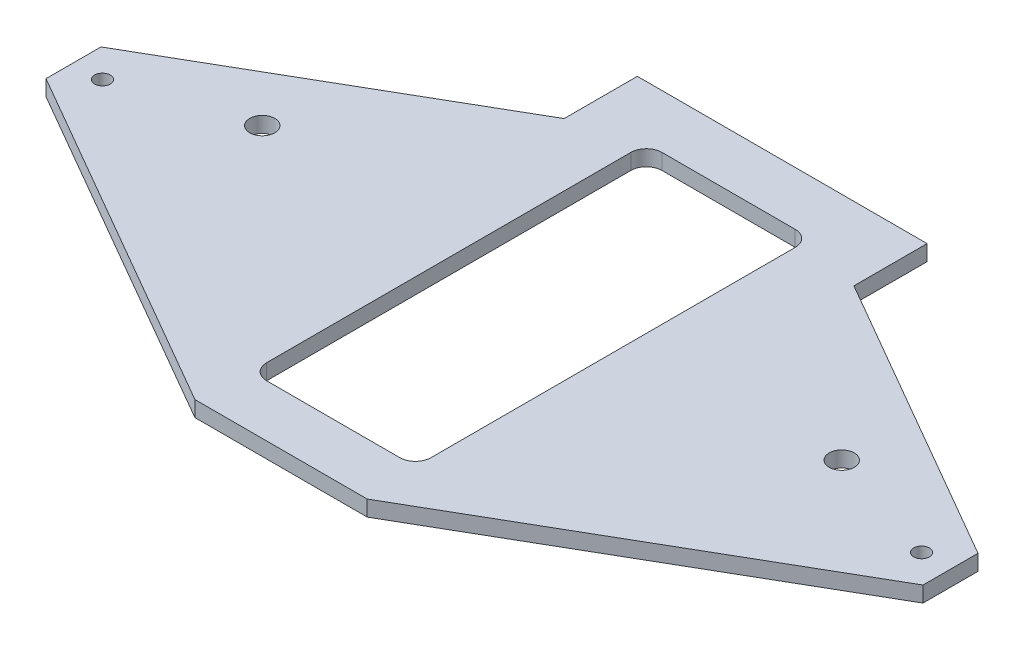
ISO-10303-21;
HEADER;
FILE_DESCRIPTION(('STEP AP214'),'2;1');
FILE_NAME('part.step','',(''),(''),'','','');
FILE_SCHEMA(('AUTOMOTIVE_DESIGN { 1 0 10303 214 1 1 1 1 }'));
ENDSEC;
DATA;
#1=APPLICATION_CONTEXT('core data for automotive mechanical design processes');
#2=APPLICATION_PROTOCOL_DEFINITION('international standard','automotive_design',2000,#1);
#3=PRODUCT_CONTEXT('',#1,'mechanical');
#4=PRODUCT('Part','Part','',(#3));
#5=PRODUCT_RELATED_PRODUCT_CATEGORY('part','',(#4));
#6=PRODUCT_DEFINITION_FORMATION('','',#4);
#7=PRODUCT_DEFINITION_CONTEXT('part definition',#1,'design');
#8=PRODUCT_DEFINITION('design','',#6,#7);
#9=PRODUCT_DEFINITION_SHAPE('','',#8);
#10=(LENGTH_UNIT() NAMED_UNIT(*) SI_UNIT(.MILLI.,.METRE.));
#11=(NAMED_UNIT(*) PLANE_ANGLE_UNIT() SI_UNIT($,.RADIAN.));
#12=(NAMED_UNIT(*) SI_UNIT($,.STERADIAN.) SOLID_ANGLE_UNIT());
#13=UNCERTAINTY_MEASURE_WITH_UNIT(LENGTH_MEASURE(1.E-05),#10,'distance_accuracy_value','');
#14=(GEOMETRIC_REPRESENTATION_CONTEXT(3) GLOBAL_UNCERTAINTY_ASSIGNED_CONTEXT((#13)) GLOBAL_UNIT_ASSIGNED_CONTEXT((#10,
#11,#12)) REPRESENTATION_CONTEXT('',''));
#15=CARTESIAN_POINT('',(0.,0.,0.));
#16=DIRECTION('',(0.,0.,1.));
#17=DIRECTION('',(1.,0.,0.));
#18=AXIS2_PLACEMENT_3D('',#15,#16,#17);
#19=CARTESIAN_POINT('',(-56.,-2.,8.61923788646676));
#20=DIRECTION('',(-0.500000000000001,0.,0.866025403784438));
#21=DIRECTION('',(0.866025403784438,0.,0.500000000000001));
#22=AXIS2_PLACEMENT_3D('',#19,#20,#21);
#23=PLANE('',#22);
#24=DIRECTION('',(0.866025403784438,0.,0.500000000000001));
#25=VECTOR('',#24,1.);
#26=CARTESIAN_POINT('',(-56.,0.,8.61923788646676));
#27=LINE('',#26,#25);
#28=CARTESIAN_POINT('',(-56.,0.,8.61923788646676));
#29=VERTEX_POINT('',#28);
#30=CARTESIAN_POINT('',(-11.,0.,34.6));
#31=VERTEX_POINT('',#30);
#32=EDGE_CURVE('E248',#29,#31,#27,.T.);
#33=ORIENTED_EDGE('',*,*,#32,.F.);
#34=DIRECTION('',(0.,1.,0.));
#35=VECTOR('',#34,1.);
#36=CARTESIAN_POINT('',(-56.,-2.,8.61923788646676));
#37=LINE('',#36,#35);
#38=CARTESIAN_POINT('',(-56.,-2.,8.61923788646676));
#39=VERTEX_POINT('',#38);
#40=EDGE_CURVE('E11',#39,#29,#37,.T.);
#41=ORIENTED_EDGE('',*,*,#40,.F.);
#42=DIRECTION('',(0.866025403784438,0.,0.500000000000001));
#43=VECTOR('',#42,1.);
#44=CARTESIAN_POINT('',(-56.,-2.,8.61923788646676));
#45=LINE('',#44,#43);
#46=CARTESIAN_POINT('',(-11.,-2.,34.6));
#47=VERTEX_POINT('',#46);
#48=EDGE_CURVE('E251',#39,#47,#45,.T.);
#49=ORIENTED_EDGE('',*,*,#48,.T.);
#50=DIRECTION('',(0.,1.,0.));
#51=VECTOR('',#50,1.);
#52=CARTESIAN_POINT('',(-11.,-2.,34.6));
#53=LINE('',#52,#51);
#54=EDGE_CURVE('E36',#47,#31,#53,.T.);
#55=ORIENTED_EDGE('',*,*,#54,.T.);
#56=EDGE_LOOP('',(#33,#41,#49,#55));
#57=FACE_BOUND('',#56,.T.);
#58=ADVANCED_FACE('F33',(#57),#23,.T.);
#59=CARTESIAN_POINT('',(-56.,-2.,1.6));
#60=DIRECTION('',(-1.,0.,0.));
#61=DIRECTION('',(0.,0.,1.));
#62=AXIS2_PLACEMENT_3D('',#59,#60,#61);
#63=PLANE('',#62);
#64=DIRECTION('',(0.,0.,1.));
#65=VECTOR('',#64,1.);
#66=CARTESIAN_POINT('',(-56.,0.,1.6));
#67=LINE('',#66,#65);
#68=CARTESIAN_POINT('',(-56.,0.,1.6));
#69=VERTEX_POINT('',#68);
#70=EDGE_CURVE('E255',#69,#29,#67,.T.);
#71=ORIENTED_EDGE('',*,*,#70,.F.);
#72=DIRECTION('',(0.,1.,0.));
#73=VECTOR('',#72,1.);
#74=CARTESIAN_POINT('',(-56.,-2.,1.6));
#75=LINE('',#74,#73);
#76=CARTESIAN_POINT('',(-56.,-2.,1.6));
#77=VERTEX_POINT('',#76);
#78=EDGE_CURVE('E41',#77,#69,#75,.T.);
#79=ORIENTED_EDGE('',*,*,#78,.F.);
#80=DIRECTION('',(0.,0.,1.));
#81=VECTOR('',#80,1.);
#82=CARTESIAN_POINT('',(-56.,-2.,1.6));
#83=LINE('',#82,#81);
#84=EDGE_CURVE('E279',#77,#39,#83,.T.);
#85=ORIENTED_EDGE('',*,*,#84,.T.);
#86=ORIENTED_EDGE('',*,*,#40,.T.);
#87=EDGE_LOOP('',(#71,#79,#85,#86));
#88=FACE_BOUND('',#87,.T.);
#89=ADVANCED_FACE('F336',(#88),#63,.T.);
#90=CARTESIAN_POINT('',(-18.5,-2.,-20.050635094611));
#91=DIRECTION('',(-0.500000000000001,0.,-0.866025403784438));
#92=DIRECTION('',(-0.866025403784438,0.,0.500000000000001));
#93=AXIS2_PLACEMENT_3D('',#90,#91,#92);
#94=PLANE('',#93);
#95=DIRECTION('',(-0.866025403784438,0.,0.500000000000001));
#96=VECTOR('',#95,1.);
#97=CARTESIAN_POINT('',(-18.5,0.,-20.050635094611));
#98=LINE('',#97,#96);
#99=CARTESIAN_POINT('',(-18.5,0.,-20.050635094611));
#100=VERTEX_POINT('',#99);
#101=EDGE_CURVE('E305',#100,#69,#98,.T.);
#102=ORIENTED_EDGE('',*,*,#101,.F.);
#103=DIRECTION('',(0.,1.,0.));
#104=VECTOR('',#103,1.);
#105=CARTESIAN_POINT('',(-18.5,-2.,-20.050635094611));
#106=LINE('',#105,#104);
#107=CARTESIAN_POINT('',(-18.5,-2.,-20.050635094611));
#108=VERTEX_POINT('',#107);
#109=EDGE_CURVE('E311',#108,#100,#106,.T.);
#110=ORIENTED_EDGE('',*,*,#109,.F.);
#111=DIRECTION('',(-0.866025403784438,0.,0.500000000000001));
#112=VECTOR('',#111,1.);
#113=CARTESIAN_POINT('',(-18.5,-2.,-20.050635094611));
#114=LINE('',#113,#112);
#115=EDGE_CURVE('E276',#108,#77,#114,.T.);
#116=ORIENTED_EDGE('',*,*,#115,.T.);
#117=ORIENTED_EDGE('',*,*,#78,.T.);
#118=EDGE_LOOP('',(#102,#110,#116,#117));
#119=FACE_BOUND('',#118,.T.);
#120=ADVANCED_FACE('F364',(#119),#94,.T.);
#121=CARTESIAN_POINT('',(-18.5,-2.,-29.4));
#122=DIRECTION('',(-1.,0.,0.));
#123=DIRECTION('',(0.,0.,1.));
#124=AXIS2_PLACEMENT_3D('',#121,#122,#123);
#125=PLANE('',#124);
#126=DIRECTION('',(0.,0.,1.));
#127=VECTOR('',#126,1.);
#128=CARTESIAN_POINT('',(-18.5,0.,-29.4));
#129=LINE('',#128,#127);
#130=CARTESIAN_POINT('',(-18.5,0.,-29.4));
#131=VERTEX_POINT('',#130);
#132=EDGE_CURVE('E302',#131,#100,#129,.T.);
#133=ORIENTED_EDGE('',*,*,#132,.F.);
#134=DIRECTION('',(0.,1.,0.));
#135=VECTOR('',#134,1.);
#136=CARTESIAN_POINT('',(-18.5,-2.,-29.4));
#137=LINE('',#136,#135);
#138=CARTESIAN_POINT('',(-18.5,-2.,-29.4));
#139=VERTEX_POINT('',#138);
#140=EDGE_CURVE('E313',#139,#131,#137,.T.);
#141=ORIENTED_EDGE('',*,*,#140,.F.);
#142=DIRECTION('',(0.,0.,1.));
#143=VECTOR('',#142,1.);
#144=CARTESIAN_POINT('',(-18.5,-2.,-29.4));
#145=LINE('',#144,#143);
#146=EDGE_CURVE('E273',#139,#108,#145,.T.);
#147=ORIENTED_EDGE('',*,*,#146,.T.);
#148=ORIENTED_EDGE('',*,*,#109,.T.);
#149=EDGE_LOOP('',(#133,#141,#147,#148));
#150=FACE_BOUND('',#149,.T.);
#151=ADVANCED_FACE('F362',(#150),#125,.T.);
#152=CARTESIAN_POINT('',(18.5,-2.,-29.4));
#153=DIRECTION('',(0.,0.,-1.));
#154=DIRECTION('',(-1.,0.,0.));
#155=AXIS2_PLACEMENT_3D('',#152,#153,#154);
#156=PLANE('',#155);
#157=DIRECTION('',(-1.,0.,0.));
#158=VECTOR('',#157,1.);
#159=CARTESIAN_POINT('',(18.5,0.,-29.4));
#160=LINE('',#159,#158);
#161=CARTESIAN_POINT('',(18.5,0.,-29.4));
#162=VERTEX_POINT('',#161);
#163=EDGE_CURVE('E299',#162,#131,#160,.T.);
#164=ORIENTED_EDGE('',*,*,#163,.F.);
#165=DIRECTION('',(0.,1.,0.));
#166=VECTOR('',#165,1.);
#167=CARTESIAN_POINT('',(18.5,-2.,-29.4));
#168=LINE('',#167,#166);
#169=CARTESIAN_POINT('',(18.5,-2.,-29.4));
#170=VERTEX_POINT('',#169);
#171=EDGE_CURVE('E315',#170,#162,#168,.T.);
#172=ORIENTED_EDGE('',*,*,#171,.F.);
#173=DIRECTION('',(-1.,0.,0.));
#174=VECTOR('',#173,1.);
#175=CARTESIAN_POINT('',(18.5,-2.,-29.4));
#176=LINE('',#175,#174);
#177=EDGE_CURVE('E270',#170,#139,#176,.T.);
#178=ORIENTED_EDGE('',*,*,#177,.T.);
#179=ORIENTED_EDGE('',*,*,#140,.T.);
#180=EDGE_LOOP('',(#164,#172,#178,#179));
#181=FACE_BOUND('',#180,.T.);
#182=ADVANCED_FACE('F358',(#181),#156,.T.);
#183=CARTESIAN_POINT('',(18.5,-2.,-20.050635094611));
#184=DIRECTION('',(1.,0.,0.));
#185=DIRECTION('',(0.,0.,-1.));
#186=AXIS2_PLACEMENT_3D('',#183,#184,#185);
#187=PLANE('',#186);
#188=DIRECTION('',(0.,0.,-1.));
#189=VECTOR('',#188,1.);
#190=CARTESIAN_POINT('',(18.5,0.,-20.050635094611));
#191=LINE('',#190,#189);
#192=CARTESIAN_POINT('',(18.5,0.,-20.050635094611));
#193=VERTEX_POINT('',#192);
#194=EDGE_CURVE('E296',#193,#162,#191,.T.);
#195=ORIENTED_EDGE('',*,*,#194,.F.);
#196=DIRECTION('',(0.,1.,0.));
#197=VECTOR('',#196,1.);
#198=CARTESIAN_POINT('',(18.5,-2.,-20.050635094611));
#199=LINE('',#198,#197);
#200=CARTESIAN_POINT('',(18.5,-2.,-20.050635094611));
#201=VERTEX_POINT('',#200);
#202=EDGE_CURVE('E317',#201,#193,#199,.T.);
#203=ORIENTED_EDGE('',*,*,#202,.F.);
#204=DIRECTION('',(0.,0.,-1.));
#205=VECTOR('',#204,1.);
#206=CARTESIAN_POINT('',(18.5,-2.,-20.050635094611));
#207=LINE('',#206,#205);
#208=EDGE_CURVE('E267',#201,#170,#207,.T.);
#209=ORIENTED_EDGE('',*,*,#208,.T.);
#210=ORIENTED_EDGE('',*,*,#171,.T.);
#211=EDGE_LOOP('',(#195,#203,#209,#210));
#212=FACE_BOUND('',#211,.T.);
#213=ADVANCED_FACE('F354',(#212),#187,.T.);
#214=CARTESIAN_POINT('',(56.,-2.,1.6));
#215=DIRECTION('',(0.500000000000001,0.,-0.866025403784438));
#216=DIRECTION('',(-0.866025403784438,0.,-0.500000000000001));
#217=AXIS2_PLACEMENT_3D('',#214,#215,#216);
#218=PLANE('',#217);
#219=DIRECTION('',(-0.866025403784438,0.,-0.500000000000001));
#220=VECTOR('',#219,1.);
#221=CARTESIAN_POINT('',(56.,0.,1.6));
#222=LINE('',#221,#220);
#223=CARTESIAN_POINT('',(56.,0.,1.6));
#224=VERTEX_POINT('',#223);
#225=EDGE_CURVE('E293',#224,#193,#222,.T.);
#226=ORIENTED_EDGE('',*,*,#225,.F.);
#227=DIRECTION('',(0.,1.,0.));
#228=VECTOR('',#227,1.);
#229=CARTESIAN_POINT('',(56.,-2.,1.6));
#230=LINE('',#229,#228);
#231=CARTESIAN_POINT('',(56.,-2.,1.6));
#232=VERTEX_POINT('',#231);
#233=EDGE_CURVE('E319',#232,#224,#230,.T.);
#234=ORIENTED_EDGE('',*,*,#233,.F.);
#235=DIRECTION('',(-0.866025403784438,0.,-0.500000000000001));
#236=VECTOR('',#235,1.);
#237=CARTESIAN_POINT('',(56.,-2.,1.6));
#238=LINE('',#237,#236);
#239=EDGE_CURVE('E264',#232,#201,#238,.T.);
#240=ORIENTED_EDGE('',*,*,#239,.T.);
#241=ORIENTED_EDGE('',*,*,#202,.T.);
#242=EDGE_LOOP('',(#226,#234,#240,#241));
#243=FACE_BOUND('',#242,.T.);
#244=ADVANCED_FACE('F350',(#243),#218,.T.);
#245=CARTESIAN_POINT('',(56.,-2.,8.61923788646676));
#246=DIRECTION('',(1.,0.,0.));
#247=DIRECTION('',(0.,0.,-1.));
#248=AXIS2_PLACEMENT_3D('',#245,#246,#247);
#249=PLANE('',#248);
#250=DIRECTION('',(0.,0.,-1.));
#251=VECTOR('',#250,1.);
#252=CARTESIAN_POINT('',(56.,0.,8.61923788646676));
#253=LINE('',#252,#251);
#254=CARTESIAN_POINT('',(56.,0.,8.61923788646676));
#255=VERTEX_POINT('',#254);
#256=EDGE_CURVE('E290',#255,#224,#253,.T.);
#257=ORIENTED_EDGE('',*,*,#256,.F.);
#258=DIRECTION('',(0.,1.,0.));
#259=VECTOR('',#258,1.);
#260=CARTESIAN_POINT('',(56.,-2.,8.61923788646676));
#261=LINE('',#260,#259);
#262=CARTESIAN_POINT('',(56.,-2.,8.61923788646676));
#263=VERTEX_POINT('',#262);
#264=EDGE_CURVE('E321',#263,#255,#261,.T.);
#265=ORIENTED_EDGE('',*,*,#264,.F.);
#266=DIRECTION('',(0.,0.,-1.));
#267=VECTOR('',#266,1.);
#268=CARTESIAN_POINT('',(56.,-2.,8.61923788646676));
#269=LINE('',#268,#267);
#270=EDGE_CURVE('E261',#263,#232,#269,.T.);
#271=ORIENTED_EDGE('',*,*,#270,.T.);
#272=ORIENTED_EDGE('',*,*,#233,.T.);
#273=EDGE_LOOP('',(#257,#265,#271,#272));
#274=FACE_BOUND('',#273,.T.);
#275=ADVANCED_FACE('F348',(#274),#249,.T.);
#276=CARTESIAN_POINT('',(11.,-2.,34.6));
#277=DIRECTION('',(0.500000000000001,0.,0.866025403784438));
#278=DIRECTION('',(0.866025403784438,0.,-0.500000000000001));
#279=AXIS2_PLACEMENT_3D('',#276,#277,#278);
#280=PLANE('',#279);
#281=DIRECTION('',(0.866025403784438,0.,-0.500000000000001));
#282=VECTOR('',#281,1.);
#283=CARTESIAN_POINT('',(11.,0.,34.6));
#284=LINE('',#283,#282);
#285=CARTESIAN_POINT('',(11.,0.,34.6));
#286=VERTEX_POINT('',#285);
#287=EDGE_CURVE('E287',#286,#255,#284,.T.);
#288=ORIENTED_EDGE('',*,*,#287,.F.);
#289=DIRECTION('',(0.,1.,0.));
#290=VECTOR('',#289,1.);
#291=CARTESIAN_POINT('',(11.,-2.,34.6));
#292=LINE('',#291,#290);
#293=CARTESIAN_POINT('',(11.,-2.,34.6));
#294=VERTEX_POINT('',#293);
#295=EDGE_CURVE('E322',#294,#286,#292,.T.);
#296=ORIENTED_EDGE('',*,*,#295,.F.);
#297=DIRECTION('',(0.866025403784438,0.,-0.500000000000001));
#298=VECTOR('',#297,1.);
#299=CARTESIAN_POINT('',(11.,-2.,34.6));
#300=LINE('',#299,#298);
#301=EDGE_CURVE('E258',#294,#263,#300,.T.);
#302=ORIENTED_EDGE('',*,*,#301,.T.);
#303=ORIENTED_EDGE('',*,*,#264,.T.);
#304=EDGE_LOOP('',(#288,#296,#302,#303));
#305=FACE_BOUND('',#304,.T.);
#306=ADVANCED_FACE('F344',(#305),#280,.T.);
#307=CARTESIAN_POINT('',(-11.,-2.,34.6));
#308=DIRECTION('',(0.,0.,1.));
#309=DIRECTION('',(1.,0.,0.));
#310=AXIS2_PLACEMENT_3D('',#307,#308,#309);
#311=PLANE('',#310);
#312=DIRECTION('',(1.,0.,0.));
#313=VECTOR('',#312,1.);
#314=CARTESIAN_POINT('',(-11.,0.,34.6));
#315=LINE('',#314,#313);
#316=EDGE_CURVE('E284',#31,#286,#315,.T.);
#317=ORIENTED_EDGE('',*,*,#316,.F.);
#318=ORIENTED_EDGE('',*,*,#54,.F.);
#319=DIRECTION('',(1.,0.,0.));
#320=VECTOR('',#319,1.);
#321=CARTESIAN_POINT('',(-11.,-2.,34.6));
#322=LINE('',#321,#320);
#323=EDGE_CURVE('E254',#47,#294,#322,.T.);
#324=ORIENTED_EDGE('',*,*,#323,.T.);
#325=ORIENTED_EDGE('',*,*,#295,.T.);
#326=EDGE_LOOP('',(#317,#318,#324,#325));
#327=FACE_BOUND('',#326,.T.);
#328=ADVANCED_FACE('F330',(#327),#311,.T.);
#329=CARTESIAN_POINT('',(0.,-2.,0.));
#330=DIRECTION('',(0.,1.,0.));
#331=DIRECTION('',(0.,0.,1.));
#332=AXIS2_PLACEMENT_3D('',#329,#330,#331);
#333=PLANE('',#332);
#334=DIRECTION('',(-1.,0.,0.));
#335=VECTOR('',#334,1.);
#336=CARTESIAN_POINT('',(-8.50000000000006,-2.,-22.556));
#337=LINE('',#336,#335);
#338=CARTESIAN_POINT('',(8.49999999999994,-2.,-22.556));
#339=VERTEX_POINT('',#338);
#340=CARTESIAN_POINT('',(-8.50000000000006,-2.,-22.556));
#341=VERTEX_POINT('',#340);
#342=EDGE_CURVE('E166',#339,#341,#337,.T.);
#343=ORIENTED_EDGE('',*,*,#342,.T.);
#344=CARTESIAN_POINT('',(-8.50000000000006,-2.,-20.556));
#345=DIRECTION('',(0.,1.,0.));
#346=DIRECTION('',(0.,0.,1.));
#347=AXIS2_PLACEMENT_3D('',#344,#345,#346);
#348=CIRCLE('',#347,2.);
#349=CARTESIAN_POINT('',(-10.5000000000001,-2.,-20.556));
#350=VERTEX_POINT('',#349);
#351=EDGE_CURVE('E160',#341,#350,#348,.T.);
#352=ORIENTED_EDGE('',*,*,#351,.T.);
#353=DIRECTION('',(0.,0.,1.));
#354=VECTOR('',#353,1.);
#355=CARTESIAN_POINT('',(-10.5000000000001,-2.,25.944));
#356=LINE('',#355,#354);
#357=CARTESIAN_POINT('',(-10.5000000000001,-2.,25.944));
#358=VERTEX_POINT('',#357);
#359=EDGE_CURVE('E169',#350,#358,#356,.T.);
#360=ORIENTED_EDGE('',*,*,#359,.T.);
#361=CARTESIAN_POINT('',(-8.50000000000006,-2.,25.944));
#362=DIRECTION('',(0.,1.,0.));
#363=DIRECTION('',(0.,0.,1.));
#364=AXIS2_PLACEMENT_3D('',#361,#362,#363);
#365=CIRCLE('',#364,2.);
#366=CARTESIAN_POINT('',(-8.50000000000006,-2.,27.944));
#367=VERTEX_POINT('',#366);
#368=EDGE_CURVE('E49',#358,#367,#365,.T.);
#369=ORIENTED_EDGE('',*,*,#368,.T.);
#370=DIRECTION('',(1.,0.,0.));
#371=VECTOR('',#370,1.);
#372=CARTESIAN_POINT('',(8.49999999999994,-2.,27.944));
#373=LINE('',#372,#371);
#374=CARTESIAN_POINT('',(8.49999999999994,-2.,27.944));
#375=VERTEX_POINT('',#374);
#376=EDGE_CURVE('E184',#367,#375,#373,.T.);
#377=ORIENTED_EDGE('',*,*,#376,.T.);
#378=CARTESIAN_POINT('',(8.49999999999994,-2.,25.944));
#379=DIRECTION('',(0.,1.,0.));
#380=DIRECTION('',(0.,0.,1.));
#381=AXIS2_PLACEMENT_3D('',#378,#379,#380);
#382=CIRCLE('',#381,2.);
#383=CARTESIAN_POINT('',(10.4999999999999,-2.,25.944));
#384=VERTEX_POINT('',#383);
#385=EDGE_CURVE('E187',#375,#384,#382,.T.);
#386=ORIENTED_EDGE('',*,*,#385,.T.);
#387=DIRECTION('',(0.,0.,-1.));
#388=VECTOR('',#387,1.);
#389=CARTESIAN_POINT('',(10.4999999999999,-2.,-20.556));
#390=LINE('',#389,#388);
#391=CARTESIAN_POINT('',(10.4999999999999,-2.,-20.556));
#392=VERTEX_POINT('',#391);
#393=EDGE_CURVE('E190',#384,#392,#390,.T.);
#394=ORIENTED_EDGE('',*,*,#393,.T.);
#395=CARTESIAN_POINT('',(8.49999999999994,-2.,-20.556));
#396=DIRECTION('',(0.,1.,0.));
#397=DIRECTION('',(0.,0.,1.));
#398=AXIS2_PLACEMENT_3D('',#395,#396,#397);
#399=CIRCLE('',#398,2.);
#400=EDGE_CURVE('E193',#392,#339,#399,.T.);
#401=ORIENTED_EDGE('',*,*,#400,.T.);
#402=EDGE_LOOP('',(#343,#352,#360,#369,#377,#386,#394,#401));
#403=FACE_BOUND('',#402,.T.);
#404=CARTESIAN_POINT('',(-37.0000000000001,-2.,0.));
#405=DIRECTION('',(0.,1.,0.));
#406=DIRECTION('',(0.,0.,1.));
#407=AXIS2_PLACEMENT_3D('',#404,#405,#406);
#408=CIRCLE('',#407,1.60000000000001);
#409=CARTESIAN_POINT('',(-37.0000000000001,-2.,1.60000000000001));
#410=VERTEX_POINT('',#409);
#411=EDGE_CURVE('E227',#410,#410,#408,.T.);
#412=ORIENTED_EDGE('',*,*,#411,.T.);
#413=EDGE_LOOP('',(#412));
#414=FACE_BOUND('',#413,.T.);
#415=CARTESIAN_POINT('',(37.,-2.,0.));
#416=DIRECTION('',(0.,1.,0.));
#417=DIRECTION('',(0.,0.,1.));
#418=AXIS2_PLACEMENT_3D('',#415,#416,#417);
#419=CIRCLE('',#418,1.6);
#420=CARTESIAN_POINT('',(37.,-2.,1.6));
#421=VERTEX_POINT('',#420);
#422=EDGE_CURVE('E233',#421,#421,#419,.T.);
#423=ORIENTED_EDGE('',*,*,#422,.T.);
#424=EDGE_LOOP('',(#423));
#425=FACE_BOUND('',#424,.T.);
#426=CARTESIAN_POINT('',(52.3,-2.,5.10961894323339));
#427=DIRECTION('',(0.,1.,0.));
#428=DIRECTION('',(0.,0.,1.));
#429=AXIS2_PLACEMENT_3D('',#426,#427,#428);
#430=CIRCLE('',#429,0.999999999999998);
#431=CARTESIAN_POINT('',(52.3,-2.,6.10961894323338));
#432=VERTEX_POINT('',#431);
#433=EDGE_CURVE('E239',#432,#432,#430,.T.);
#434=ORIENTED_EDGE('',*,*,#433,.T.);
#435=EDGE_LOOP('',(#434));
#436=FACE_BOUND('',#435,.T.);
#437=CARTESIAN_POINT('',(-52.3,-2.,5.10961894323339));
#438=DIRECTION('',(0.,1.,0.));
#439=DIRECTION('',(0.,0.,1.));
#440=AXIS2_PLACEMENT_3D('',#437,#438,#439);
#441=CIRCLE('',#440,0.999999999999998);
#442=CARTESIAN_POINT('',(-52.3,-2.,6.10961894323338));
#443=VERTEX_POINT('',#442);
#444=EDGE_CURVE('E245',#443,#443,#441,.T.);
#445=ORIENTED_EDGE('',*,*,#444,.T.);
#446=EDGE_LOOP('',(#445));
#447=FACE_BOUND('',#446,.T.);
#448=ORIENTED_EDGE('',*,*,#48,.F.);
#449=ORIENTED_EDGE('',*,*,#84,.F.);
#450=ORIENTED_EDGE('',*,*,#115,.F.);
#451=ORIENTED_EDGE('',*,*,#146,.F.);
#452=ORIENTED_EDGE('',*,*,#177,.F.);
#453=ORIENTED_EDGE('',*,*,#208,.F.);
#454=ORIENTED_EDGE('',*,*,#239,.F.);
#455=ORIENTED_EDGE('',*,*,#270,.F.);
#456=ORIENTED_EDGE('',*,*,#301,.F.);
#457=ORIENTED_EDGE('',*,*,#323,.F.);
#458=EDGE_LOOP('',(#448,#449,#450,#451,#452,#453,#454,#455,#456,#457));
#459=FACE_BOUND('',#458,.T.);
#460=ADVANCED_FACE('F173',(#403,#414,#425,#436,#447,#459),#333,.F.);
#461=CARTESIAN_POINT('',(0.,0.,0.));
#462=DIRECTION('',(0.,1.,0.));
#463=DIRECTION('',(0.,0.,1.));
#464=AXIS2_PLACEMENT_3D('',#461,#462,#463);
#465=PLANE('',#464);
#466=CARTESIAN_POINT('',(-8.50000000000006,0.,-20.556));
#467=DIRECTION('',(0.,1.,0.));
#468=DIRECTION('',(0.,0.,1.));
#469=AXIS2_PLACEMENT_3D('',#466,#467,#468);
#470=CIRCLE('',#469,2.);
#471=CARTESIAN_POINT('',(-8.50000000000006,0.,-22.556));
#472=VERTEX_POINT('',#471);
#473=CARTESIAN_POINT('',(-10.5000000000001,0.,-20.556));
#474=VERTEX_POINT('',#473);
#475=EDGE_CURVE('E57',#472,#474,#470,.T.);
#476=ORIENTED_EDGE('',*,*,#475,.F.);
#477=DIRECTION('',(-1.,0.,0.));
#478=VECTOR('',#477,1.);
#479=CARTESIAN_POINT('',(-8.50000000000006,0.,-22.556));
#480=LINE('',#479,#478);
#481=CARTESIAN_POINT('',(8.49999999999994,0.,-22.556));
#482=VERTEX_POINT('',#481);
#483=EDGE_CURVE('E177',#482,#472,#480,.T.);
#484=ORIENTED_EDGE('',*,*,#483,.F.);
#485=CARTESIAN_POINT('',(8.49999999999994,0.,-20.556));
#486=DIRECTION('',(0.,1.,0.));
#487=DIRECTION('',(0.,0.,1.));
#488=AXIS2_PLACEMENT_3D('',#485,#486,#487);
#489=CIRCLE('',#488,2.);
#490=CARTESIAN_POINT('',(10.4999999999999,0.,-20.556));
#491=VERTEX_POINT('',#490);
#492=EDGE_CURVE('E180',#491,#482,#489,.T.);
#493=ORIENTED_EDGE('',*,*,#492,.F.);
#494=DIRECTION('',(0.,0.,-1.));
#495=VECTOR('',#494,1.);
#496=CARTESIAN_POINT('',(10.4999999999999,0.,-20.556));
#497=LINE('',#496,#495);
#498=CARTESIAN_POINT('',(10.4999999999999,0.,25.944));
#499=VERTEX_POINT('',#498);
#500=EDGE_CURVE('E208',#499,#491,#497,.T.);
#501=ORIENTED_EDGE('',*,*,#500,.F.);
#502=CARTESIAN_POINT('',(8.49999999999994,0.,25.944));
#503=DIRECTION('',(0.,1.,0.));
#504=DIRECTION('',(0.,0.,1.));
#505=AXIS2_PLACEMENT_3D('',#502,#503,#504);
#506=CIRCLE('',#505,2.);
#507=CARTESIAN_POINT('',(8.49999999999994,0.,27.944));
#508=VERTEX_POINT('',#507);
#509=EDGE_CURVE('E205',#508,#499,#506,.T.);
#510=ORIENTED_EDGE('',*,*,#509,.F.);
#511=DIRECTION('',(1.,0.,0.));
#512=VECTOR('',#511,1.);
#513=CARTESIAN_POINT('',(8.49999999999994,0.,27.944));
#514=LINE('',#513,#512);
#515=CARTESIAN_POINT('',(-8.50000000000006,0.,27.944));
#516=VERTEX_POINT('',#515);
#517=EDGE_CURVE('E202',#516,#508,#514,.T.);
#518=ORIENTED_EDGE('',*,*,#517,.F.);
#519=CARTESIAN_POINT('',(-8.50000000000006,0.,25.944));
#520=DIRECTION('',(0.,1.,0.));
#521=DIRECTION('',(0.,0.,1.));
#522=AXIS2_PLACEMENT_3D('',#519,#520,#521);
#523=CIRCLE('',#522,2.);
#524=CARTESIAN_POINT('',(-10.5000000000001,0.,25.944));
#525=VERTEX_POINT('',#524);
#526=EDGE_CURVE('E199',#525,#516,#523,.T.);
#527=ORIENTED_EDGE('',*,*,#526,.F.);
#528=DIRECTION('',(0.,0.,1.));
#529=VECTOR('',#528,1.);
#530=CARTESIAN_POINT('',(-10.5000000000001,0.,25.944));
#531=LINE('',#530,#529);
#532=EDGE_CURVE('E197',#474,#525,#531,.T.);
#533=ORIENTED_EDGE('',*,*,#532,.F.);
#534=EDGE_LOOP('',(#476,#484,#493,#501,#510,#518,#527,#533));
#535=FACE_BOUND('',#534,.T.);
#536=CARTESIAN_POINT('',(-37.0000000000001,0.,0.));
#537=DIRECTION('',(0.,1.,0.));
#538=DIRECTION('',(0.,0.,1.));
#539=AXIS2_PLACEMENT_3D('',#536,#537,#538);
#540=CIRCLE('',#539,1.60000000000001);
#541=CARTESIAN_POINT('',(-37.0000000000001,0.,1.60000000000001));
#542=VERTEX_POINT('',#541);
#543=EDGE_CURVE('E215',#542,#542,#540,.T.);
#544=ORIENTED_EDGE('',*,*,#543,.F.);
#545=EDGE_LOOP('',(#544));
#546=FACE_BOUND('',#545,.T.);
#547=CARTESIAN_POINT('',(37.,0.,0.));
#548=DIRECTION('',(0.,1.,0.));
#549=DIRECTION('',(0.,0.,1.));
#550=AXIS2_PLACEMENT_3D('',#547,#548,#549);
#551=CIRCLE('',#550,1.6);
#552=CARTESIAN_POINT('',(37.,0.,1.6));
#553=VERTEX_POINT('',#552);
#554=EDGE_CURVE('E230',#553,#553,#551,.T.);
#555=ORIENTED_EDGE('',*,*,#554,.F.);
#556=EDGE_LOOP('',(#555));
#557=FACE_BOUND('',#556,.T.);
#558=CARTESIAN_POINT('',(52.3,0.,5.10961894323339));
#559=DIRECTION('',(0.,1.,0.));
#560=DIRECTION('',(0.,0.,1.));
#561=AXIS2_PLACEMENT_3D('',#558,#559,#560);
#562=CIRCLE('',#561,0.999999999999998);
#563=CARTESIAN_POINT('',(52.3,0.,6.10961894323338));
#564=VERTEX_POINT('',#563);
#565=EDGE_CURVE('E236',#564,#564,#562,.T.);
#566=ORIENTED_EDGE('',*,*,#565,.F.);
#567=EDGE_LOOP('',(#566));
#568=FACE_BOUND('',#567,.T.);
#569=CARTESIAN_POINT('',(-52.3,0.,5.10961894323339));
#570=DIRECTION('',(0.,1.,0.));
#571=DIRECTION('',(0.,0.,1.));
#572=AXIS2_PLACEMENT_3D('',#569,#570,#571);
#573=CIRCLE('',#572,0.999999999999998);
#574=CARTESIAN_POINT('',(-52.3,0.,6.10961894323338));
#575=VERTEX_POINT('',#574);
#576=EDGE_CURVE('E242',#575,#575,#573,.T.);
#577=ORIENTED_EDGE('',*,*,#576,.F.);
#578=EDGE_LOOP('',(#577));
#579=FACE_BOUND('',#578,.T.);
#580=ORIENTED_EDGE('',*,*,#32,.T.);
#581=ORIENTED_EDGE('',*,*,#316,.T.);
#582=ORIENTED_EDGE('',*,*,#287,.T.);
#583=ORIENTED_EDGE('',*,*,#256,.T.);
#584=ORIENTED_EDGE('',*,*,#225,.T.);
#585=ORIENTED_EDGE('',*,*,#194,.T.);
#586=ORIENTED_EDGE('',*,*,#163,.T.);
#587=ORIENTED_EDGE('',*,*,#132,.T.);
#588=ORIENTED_EDGE('',*,*,#101,.T.);
#589=ORIENTED_EDGE('',*,*,#70,.T.);
#590=EDGE_LOOP('',(#580,#581,#582,#583,#584,#585,#586,#587,#588,#589));
#591=FACE_BOUND('',#590,.T.);
#592=ADVANCED_FACE('F332',(#535,#546,#557,#568,#579,#591),#465,.T.);
#593=CARTESIAN_POINT('',(-52.3,-2.,5.10961894323339));
#594=DIRECTION('',(0.,1.,0.));
#595=DIRECTION('',(0.,0.,1.));
#596=AXIS2_PLACEMENT_3D('',#593,#594,#595);
#597=CYLINDRICAL_SURFACE('',#596,0.999999999999998);
#598=ORIENTED_EDGE('',*,*,#444,.F.);
#599=EDGE_LOOP('',(#598));
#600=FACE_BOUND('',#599,.T.);
#601=ORIENTED_EDGE('',*,*,#576,.T.);
#602=EDGE_LOOP('',(#601));
#603=FACE_BOUND('',#602,.T.);
#604=ADVANCED_FACE('F454',(#600,#603),#597,.F.);
#605=CARTESIAN_POINT('',(52.3,-2.,5.10961894323339));
#606=DIRECTION('',(0.,1.,0.));
#607=DIRECTION('',(0.,0.,1.));
#608=AXIS2_PLACEMENT_3D('',#605,#606,#607);
#609=CYLINDRICAL_SURFACE('',#608,0.999999999999998);
#610=ORIENTED_EDGE('',*,*,#433,.F.);
#611=EDGE_LOOP('',(#610));
#612=FACE_BOUND('',#611,.T.);
#613=ORIENTED_EDGE('',*,*,#565,.T.);
#614=EDGE_LOOP('',(#613));
#615=FACE_BOUND('',#614,.T.);
#616=ADVANCED_FACE('F464',(#612,#615),#609,.F.);
#617=CARTESIAN_POINT('',(37.,-2.,0.));
#618=DIRECTION('',(0.,1.,0.));
#619=DIRECTION('',(0.,0.,1.));
#620=AXIS2_PLACEMENT_3D('',#617,#618,#619);
#621=CYLINDRICAL_SURFACE('',#620,1.6);
#622=ORIENTED_EDGE('',*,*,#422,.F.);
#623=EDGE_LOOP('',(#622));
#624=FACE_BOUND('',#623,.T.);
#625=ORIENTED_EDGE('',*,*,#554,.T.);
#626=EDGE_LOOP('',(#625));
#627=FACE_BOUND('',#626,.T.);
#628=ADVANCED_FACE('F474',(#624,#627),#621,.F.);
#629=CARTESIAN_POINT('',(-37.0000000000001,-2.,0.));
#630=DIRECTION('',(0.,1.,0.));
#631=DIRECTION('',(0.,0.,1.));
#632=AXIS2_PLACEMENT_3D('',#629,#630,#631);
#633=CYLINDRICAL_SURFACE('',#632,1.60000000000001);
#634=ORIENTED_EDGE('',*,*,#411,.F.);
#635=EDGE_LOOP('',(#634));
#636=FACE_BOUND('',#635,.T.);
#637=ORIENTED_EDGE('',*,*,#543,.T.);
#638=EDGE_LOOP('',(#637));
#639=FACE_BOUND('',#638,.T.);
#640=ADVANCED_FACE('F484',(#636,#639),#633,.F.);
#641=CARTESIAN_POINT('',(-8.50000000000006,-2.,-20.556));
#642=DIRECTION('',(0.,1.,0.));
#643=DIRECTION('',(0.,0.,1.));
#644=AXIS2_PLACEMENT_3D('',#641,#642,#643);
#645=CYLINDRICAL_SURFACE('',#644,2.);
#646=ORIENTED_EDGE('',*,*,#475,.T.);
#647=DIRECTION('',(0.,1.,0.));
#648=VECTOR('',#647,1.);
#649=CARTESIAN_POINT('',(-10.5000000000001,-2.,-20.556));
#650=LINE('',#649,#648);
#651=EDGE_CURVE('E156',#350,#474,#650,.T.);
#652=ORIENTED_EDGE('',*,*,#651,.F.);
#653=ORIENTED_EDGE('',*,*,#351,.F.);
#654=DIRECTION('',(0.,1.,0.));
#655=VECTOR('',#654,1.);
#656=CARTESIAN_POINT('',(-8.50000000000006,-2.,-22.556));
#657=LINE('',#656,#655);
#658=EDGE_CURVE('E213',#341,#472,#657,.T.);
#659=ORIENTED_EDGE('',*,*,#658,.T.);
#660=EDGE_LOOP('',(#646,#652,#653,#659));
#661=FACE_BOUND('',#660,.T.);
#662=ADVANCED_FACE('F158',(#661),#645,.F.);
#663=CARTESIAN_POINT('',(-8.50000000000006,-2.,-22.556));
#664=DIRECTION('',(0.,0.,-1.));
#665=DIRECTION('',(-1.,0.,0.));
#666=AXIS2_PLACEMENT_3D('',#663,#664,#665);
#667=PLANE('',#666);
#668=ORIENTED_EDGE('',*,*,#483,.T.);
#669=ORIENTED_EDGE('',*,*,#658,.F.);
#670=ORIENTED_EDGE('',*,*,#342,.F.);
#671=DIRECTION('',(0.,1.,0.));
#672=VECTOR('',#671,1.);
#673=CARTESIAN_POINT('',(8.49999999999994,-2.,-22.556));
#674=LINE('',#673,#672);
#675=EDGE_CURVE('E216',#339,#482,#674,.T.);
#676=ORIENTED_EDGE('',*,*,#675,.T.);
#677=EDGE_LOOP('',(#668,#669,#670,#676));
#678=FACE_BOUND('',#677,.T.);
#679=ADVANCED_FACE('F503',(#678),#667,.F.);
#680=CARTESIAN_POINT('',(8.49999999999994,-2.,-20.556));
#681=DIRECTION('',(0.,1.,0.));
#682=DIRECTION('',(0.,0.,1.));
#683=AXIS2_PLACEMENT_3D('',#680,#681,#682);
#684=CYLINDRICAL_SURFACE('',#683,2.);
#685=ORIENTED_EDGE('',*,*,#492,.T.);
#686=ORIENTED_EDGE('',*,*,#675,.F.);
#687=ORIENTED_EDGE('',*,*,#400,.F.);
#688=DIRECTION('',(0.,1.,0.));
#689=VECTOR('',#688,1.);
#690=CARTESIAN_POINT('',(10.4999999999999,-2.,-20.556));
#691=LINE('',#690,#689);
#692=EDGE_CURVE('E218',#392,#491,#691,.T.);
#693=ORIENTED_EDGE('',*,*,#692,.T.);
#694=EDGE_LOOP('',(#685,#686,#687,#693));
#695=FACE_BOUND('',#694,.T.);
#696=ADVANCED_FACE('F512',(#695),#684,.F.);
#697=CARTESIAN_POINT('',(10.4999999999999,-2.,-20.556));
#698=DIRECTION('',(1.,0.,0.));
#699=DIRECTION('',(0.,0.,-1.));
#700=AXIS2_PLACEMENT_3D('',#697,#698,#699);
#701=PLANE('',#700);
#702=ORIENTED_EDGE('',*,*,#500,.T.);
#703=ORIENTED_EDGE('',*,*,#692,.F.);
#704=ORIENTED_EDGE('',*,*,#393,.F.);
#705=DIRECTION('',(0.,1.,0.));
#706=VECTOR('',#705,1.);
#707=CARTESIAN_POINT('',(10.4999999999999,-2.,25.944));
#708=LINE('',#707,#706);
#709=EDGE_CURVE('E220',#384,#499,#708,.T.);
#710=ORIENTED_EDGE('',*,*,#709,.T.);
#711=EDGE_LOOP('',(#702,#703,#704,#710));
#712=FACE_BOUND('',#711,.T.);
#713=ADVANCED_FACE('F522',(#712),#701,.F.);
#714=CARTESIAN_POINT('',(8.49999999999994,-2.,25.944));
#715=DIRECTION('',(0.,1.,0.));
#716=DIRECTION('',(0.,0.,1.));
#717=AXIS2_PLACEMENT_3D('',#714,#715,#716);
#718=CYLINDRICAL_SURFACE('',#717,2.);
#719=ORIENTED_EDGE('',*,*,#509,.T.);
#720=ORIENTED_EDGE('',*,*,#709,.F.);
#721=ORIENTED_EDGE('',*,*,#385,.F.);
#722=DIRECTION('',(0.,1.,0.));
#723=VECTOR('',#722,1.);
#724=CARTESIAN_POINT('',(8.49999999999994,-2.,27.944));
#725=LINE('',#724,#723);
#726=EDGE_CURVE('E222',#375,#508,#725,.T.);
#727=ORIENTED_EDGE('',*,*,#726,.T.);
#728=EDGE_LOOP('',(#719,#720,#721,#727));
#729=FACE_BOUND('',#728,.T.);
#730=ADVANCED_FACE('F532',(#729),#718,.F.);
#731=CARTESIAN_POINT('',(8.49999999999994,-2.,27.944));
#732=DIRECTION('',(0.,0.,1.));
#733=DIRECTION('',(1.,0.,0.));
#734=AXIS2_PLACEMENT_3D('',#731,#732,#733);
#735=PLANE('',#734);
#736=ORIENTED_EDGE('',*,*,#517,.T.);
#737=ORIENTED_EDGE('',*,*,#726,.F.);
#738=ORIENTED_EDGE('',*,*,#376,.F.);
#739=DIRECTION('',(0.,1.,0.));
#740=VECTOR('',#739,1.);
#741=CARTESIAN_POINT('',(-8.50000000000006,-2.,27.944));
#742=LINE('',#741,#740);
#743=EDGE_CURVE('E224',#367,#516,#742,.T.);
#744=ORIENTED_EDGE('',*,*,#743,.T.);
#745=EDGE_LOOP('',(#736,#737,#738,#744));
#746=FACE_BOUND('',#745,.T.);
#747=ADVANCED_FACE('F542',(#746),#735,.F.);
#748=CARTESIAN_POINT('',(-8.50000000000006,-2.,25.944));
#749=DIRECTION('',(0.,1.,0.));
#750=DIRECTION('',(0.,0.,1.));
#751=AXIS2_PLACEMENT_3D('',#748,#749,#750);
#752=CYLINDRICAL_SURFACE('',#751,2.);
#753=ORIENTED_EDGE('',*,*,#526,.T.);
#754=ORIENTED_EDGE('',*,*,#743,.F.);
#755=ORIENTED_EDGE('',*,*,#368,.F.);
#756=DIRECTION('',(0.,1.,0.));
#757=VECTOR('',#756,1.);
#758=CARTESIAN_POINT('',(-10.5000000000001,-2.,25.944));
#759=LINE('',#758,#757);
#760=EDGE_CURVE('E165',#358,#525,#759,.T.);
#761=ORIENTED_EDGE('',*,*,#760,.T.);
#762=EDGE_LOOP('',(#753,#754,#755,#761));
#763=FACE_BOUND('',#762,.T.);
#764=ADVANCED_FACE('F552',(#763),#752,.F.);
#765=CARTESIAN_POINT('',(-10.5000000000001,-2.,25.944));
#766=DIRECTION('',(-1.,0.,0.));
#767=DIRECTION('',(0.,0.,1.));
#768=AXIS2_PLACEMENT_3D('',#765,#766,#767);
#769=PLANE('',#768);
#770=ORIENTED_EDGE('',*,*,#532,.T.);
#771=ORIENTED_EDGE('',*,*,#760,.F.);
#772=ORIENTED_EDGE('',*,*,#359,.F.);
#773=ORIENTED_EDGE('',*,*,#651,.T.);
#774=EDGE_LOOP('',(#770,#771,#772,#773));
#775=FACE_BOUND('',#774,.T.);
#776=ADVANCED_FACE('F170',(#775),#769,.F.);
#777=CLOSED_SHELL('',(#58,#89,#120,#151,#182,#213,#244,#275,#306,#328,#460,#592,#604,#616,#628,
#640,#662,#679,#696,#713,#730,#747,#764,#776));
#778=MANIFOLD_SOLID_BREP('B2',#777);
#779=ADVANCED_BREP_SHAPE_REPRESENTATION('',(#18,#778),#14);
#780=SHAPE_DEFINITION_REPRESENTATION(#9,#779);
ENDSEC;
END-ISO-10303-21;
